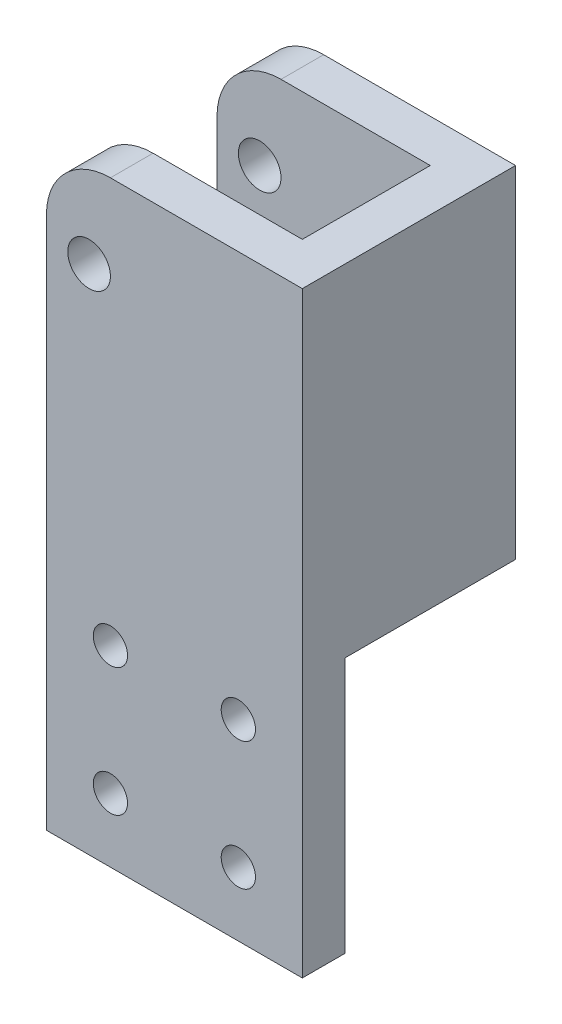
ISO-10303-21;
HEADER;
FILE_DESCRIPTION(('STEP AP214'),'2;1');
FILE_NAME('part.step','',(''),(''),'','','');
FILE_SCHEMA(('AUTOMOTIVE_DESIGN { 1 0 10303 214 1 1 1 1 }'));
ENDSEC;
DATA;
#1=APPLICATION_CONTEXT('core data for automotive mechanical design processes');
#2=APPLICATION_PROTOCOL_DEFINITION('international standard','automotive_design',2000,#1);
#3=PRODUCT_CONTEXT('',#1,'mechanical');
#4=PRODUCT('Part','Part','',(#3));
#5=PRODUCT_RELATED_PRODUCT_CATEGORY('part','',(#4));
#6=PRODUCT_DEFINITION_FORMATION('','',#4);
#7=PRODUCT_DEFINITION_CONTEXT('part definition',#1,'design');
#8=PRODUCT_DEFINITION('design','',#6,#7);
#9=PRODUCT_DEFINITION_SHAPE('','',#8);
#10=(LENGTH_UNIT() NAMED_UNIT(*) SI_UNIT(.MILLI.,.METRE.));
#11=(NAMED_UNIT(*) PLANE_ANGLE_UNIT() SI_UNIT($,.RADIAN.));
#12=(NAMED_UNIT(*) SI_UNIT($,.STERADIAN.) SOLID_ANGLE_UNIT());
#13=UNCERTAINTY_MEASURE_WITH_UNIT(LENGTH_MEASURE(1.E-05),#10,'distance_accuracy_value','');
#14=(GEOMETRIC_REPRESENTATION_CONTEXT(3) GLOBAL_UNCERTAINTY_ASSIGNED_CONTEXT((#13)) GLOBAL_UNIT_ASSIGNED_CONTEXT((#10,
#11,#12)) REPRESENTATION_CONTEXT('',''));
#15=CARTESIAN_POINT('',(0.,0.,0.));
#16=DIRECTION('',(0.,0.,1.));
#17=DIRECTION('',(1.,0.,0.));
#18=AXIS2_PLACEMENT_3D('',#15,#16,#17);
#19=CARTESIAN_POINT('',(31.75,0.,-6.35));
#20=DIRECTION('',(0.,0.,1.));
#21=DIRECTION('',(1.,0.,0.));
#22=AXIS2_PLACEMENT_3D('',#19,#20,#21);
#23=PLANE('',#22);
#24=CARTESIAN_POINT('',(9.525,-3.175,-6.35));
#25=DIRECTION('',(0.,0.,1.));
#26=DIRECTION('',(1.,0.,0.));
#27=AXIS2_PLACEMENT_3D('',#24,#25,#26);
#28=CIRCLE('',#27,2.55269999999999);
#29=CARTESIAN_POINT('',(12.0777,-3.175,-6.35));
#30=VERTEX_POINT('',#29);
#31=EDGE_CURVE('E334',#30,#30,#28,.T.);
#32=ORIENTED_EDGE('',*,*,#31,.T.);
#33=EDGE_LOOP('',(#32));
#34=FACE_BOUND('',#33,.T.);
#35=CARTESIAN_POINT('',(28.575,-3.17500000000059,-6.35));
#36=DIRECTION('',(0.,0.,1.));
#37=DIRECTION('',(1.,0.,0.));
#38=AXIS2_PLACEMENT_3D('',#35,#36,#37);
#39=CIRCLE('',#38,2.55269999999999);
#40=CARTESIAN_POINT('',(31.1277,-3.17500000000059,-6.35));
#41=VERTEX_POINT('',#40);
#42=EDGE_CURVE('E338',#41,#41,#39,.T.);
#43=ORIENTED_EDGE('',*,*,#42,.T.);
#44=EDGE_LOOP('',(#43));
#45=FACE_BOUND('',#44,.T.);
#46=CARTESIAN_POINT('',(9.525,15.875,-6.35));
#47=DIRECTION('',(0.,0.,1.));
#48=DIRECTION('',(1.,0.,0.));
#49=AXIS2_PLACEMENT_3D('',#46,#47,#48);
#50=CIRCLE('',#49,2.55269999999999);
#51=CARTESIAN_POINT('',(12.0777,15.875,-6.35));
#52=VERTEX_POINT('',#51);
#53=EDGE_CURVE('E347',#52,#52,#50,.T.);
#54=ORIENTED_EDGE('',*,*,#53,.T.);
#55=EDGE_LOOP('',(#54));
#56=FACE_BOUND('',#55,.T.);
#57=CARTESIAN_POINT('',(28.575,15.875,-6.35));
#58=DIRECTION('',(0.,0.,1.));
#59=DIRECTION('',(1.,0.,0.));
#60=AXIS2_PLACEMENT_3D('',#57,#58,#59);
#61=CIRCLE('',#60,2.55269999999999);
#62=CARTESIAN_POINT('',(31.1277,15.875,-6.35));
#63=VERTEX_POINT('',#62);
#64=EDGE_CURVE('E147',#63,#63,#61,.T.);
#65=ORIENTED_EDGE('',*,*,#64,.T.);
#66=EDGE_LOOP('',(#65));
#67=FACE_BOUND('',#66,.T.);
#68=DIRECTION('',(0.,1.,0.));
#69=VECTOR('',#68,1.);
#70=CARTESIAN_POINT('',(0.,0.,-6.35));
#71=LINE('',#70,#69);
#72=CARTESIAN_POINT('',(0.,-12.7,-6.35));
#73=VERTEX_POINT('',#72);
#74=CARTESIAN_POINT('',(0.,25.4,-6.35));
#75=VERTEX_POINT('',#74);
#76=EDGE_CURVE('E122',#73,#75,#71,.T.);
#77=ORIENTED_EDGE('',*,*,#76,.T.);
#78=DIRECTION('',(-1.,0.,0.));
#79=VECTOR('',#78,1.);
#80=CARTESIAN_POINT('',(38.1,25.4,-6.35));
#81=LINE('',#80,#79);
#82=CARTESIAN_POINT('',(38.1,25.4,-6.35));
#83=VERTEX_POINT('',#82);
#84=EDGE_CURVE('E55',#83,#75,#81,.T.);
#85=ORIENTED_EDGE('',*,*,#84,.F.);
#86=DIRECTION('',(0.,1.,0.));
#87=VECTOR('',#86,1.);
#88=CARTESIAN_POINT('',(38.1,0.,-6.35));
#89=LINE('',#88,#87);
#90=CARTESIAN_POINT('',(38.1,-12.7,-6.35));
#91=VERTEX_POINT('',#90);
#92=EDGE_CURVE('E137',#91,#83,#89,.T.);
#93=ORIENTED_EDGE('',*,*,#92,.F.);
#94=DIRECTION('',(1.,0.,0.));
#95=VECTOR('',#94,1.);
#96=CARTESIAN_POINT('',(0.,-12.7,-6.35));
#97=LINE('',#96,#95);
#98=EDGE_CURVE('E135',#73,#91,#97,.T.);
#99=ORIENTED_EDGE('',*,*,#98,.F.);
#100=EDGE_LOOP('',(#77,#85,#93,#99));
#101=FACE_BOUND('',#100,.T.);
#102=ADVANCED_FACE('F32',(#34,#45,#56,#67,#101),#23,.F.);
#103=CARTESIAN_POINT('',(0.,0.,-31.75));
#104=DIRECTION('',(-1.,0.,0.));
#105=DIRECTION('',(0.,0.,1.));
#106=AXIS2_PLACEMENT_3D('',#103,#104,#105);
#107=PLANE('',#106);
#108=DIRECTION('',(0.,-1.,0.));
#109=VECTOR('',#108,1.);
#110=CARTESIAN_POINT('',(0.,0.,0.));
#111=LINE('',#110,#109);
#112=CARTESIAN_POINT('',(0.,66.675,0.));
#113=VERTEX_POINT('',#112);
#114=CARTESIAN_POINT('',(0.,-12.7,0.));
#115=VERTEX_POINT('',#114);
#116=EDGE_CURVE('E199',#113,#115,#111,.T.);
#117=ORIENTED_EDGE('',*,*,#116,.F.);
#118=DIRECTION('',(0.,0.,1.));
#119=VECTOR('',#118,1.);
#120=CARTESIAN_POINT('',(0.,66.675,-31.75));
#121=LINE('',#120,#119);
#122=CARTESIAN_POINT('',(0.,66.675,-6.35));
#123=VERTEX_POINT('',#122);
#124=EDGE_CURVE('E224',#113,#123,#121,.F.);
#125=ORIENTED_EDGE('',*,*,#124,.T.);
#126=CARTESIAN_POINT('',(0.,31.75,-6.35));
#127=VERTEX_POINT('',#126);
#128=EDGE_CURVE('E132',#127,#123,#71,.T.);
#129=ORIENTED_EDGE('',*,*,#128,.F.);
#130=DIRECTION('',(0.,0.,-1.));
#131=VECTOR('',#130,1.);
#132=CARTESIAN_POINT('',(0.,31.75,-25.4));
#133=LINE('',#132,#131);
#134=CARTESIAN_POINT('',(0.,31.75,-25.4));
#135=VERTEX_POINT('',#134);
#136=EDGE_CURVE('E156',#127,#135,#133,.T.);
#137=ORIENTED_EDGE('',*,*,#136,.T.);
#138=DIRECTION('',(0.,1.,0.));
#139=VECTOR('',#138,1.);
#140=CARTESIAN_POINT('',(0.,25.4,-25.4));
#141=LINE('',#140,#139);
#142=CARTESIAN_POINT('',(0.,66.675,-25.4));
#143=VERTEX_POINT('',#142);
#144=EDGE_CURVE('E176',#135,#143,#141,.T.);
#145=ORIENTED_EDGE('',*,*,#144,.T.);
#146=DIRECTION('',(0.,0.,1.));
#147=VECTOR('',#146,1.);
#148=CARTESIAN_POINT('',(0.,66.675,0.));
#149=LINE('',#148,#147);
#150=CARTESIAN_POINT('',(0.,66.675,-31.75));
#151=VERTEX_POINT('',#150);
#152=EDGE_CURVE('E40',#143,#151,#149,.F.);
#153=ORIENTED_EDGE('',*,*,#152,.T.);
#154=DIRECTION('',(0.,1.,0.));
#155=VECTOR('',#154,1.);
#156=CARTESIAN_POINT('',(0.,25.4,-31.75));
#157=LINE('',#156,#155);
#158=CARTESIAN_POINT('',(0.,25.4,-31.75));
#159=VERTEX_POINT('',#158);
#160=EDGE_CURVE('E179',#159,#151,#157,.T.);
#161=ORIENTED_EDGE('',*,*,#160,.F.);
#162=DIRECTION('',(0.,0.,1.));
#163=VECTOR('',#162,1.);
#164=CARTESIAN_POINT('',(0.,25.4,0.));
#165=LINE('',#164,#163);
#166=EDGE_CURVE('E129',#159,#75,#165,.T.);
#167=ORIENTED_EDGE('',*,*,#166,.T.);
#168=ORIENTED_EDGE('',*,*,#76,.F.);
#169=DIRECTION('',(0.,0.,-1.));
#170=VECTOR('',#169,1.);
#171=CARTESIAN_POINT('',(0.,-12.7,-6.35));
#172=LINE('',#171,#170);
#173=EDGE_CURVE('E127',#115,#73,#172,.T.);
#174=ORIENTED_EDGE('',*,*,#173,.F.);
#175=EDGE_LOOP('',(#117,#125,#129,#137,#145,#153,#161,#167,#168,#174));
#176=FACE_BOUND('',#175,.T.);
#177=ADVANCED_FACE('F125',(#176),#107,.T.);
#178=CARTESIAN_POINT('',(0.,76.2,-31.75));
#179=DIRECTION('',(0.,1.,0.));
#180=DIRECTION('',(0.,0.,1.));
#181=AXIS2_PLACEMENT_3D('',#178,#179,#180);
#182=PLANE('',#181);
#183=DIRECTION('',(-1.,0.,0.));
#184=VECTOR('',#183,1.);
#185=CARTESIAN_POINT('',(31.75,76.2,-6.35));
#186=LINE('',#185,#184);
#187=CARTESIAN_POINT('',(31.75,76.2,-6.35));
#188=VERTEX_POINT('',#187);
#189=CARTESIAN_POINT('',(9.525,76.2,-6.35));
#190=VERTEX_POINT('',#189);
#191=EDGE_CURVE('E195',#188,#190,#186,.T.);
#192=ORIENTED_EDGE('',*,*,#191,.T.);
#193=DIRECTION('',(0.,0.,1.));
#194=VECTOR('',#193,1.);
#195=CARTESIAN_POINT('',(9.525,76.2,-31.75));
#196=LINE('',#195,#194);
#197=CARTESIAN_POINT('',(9.525,76.2,0.));
#198=VERTEX_POINT('',#197);
#199=EDGE_CURVE('E219',#190,#198,#196,.T.);
#200=ORIENTED_EDGE('',*,*,#199,.T.);
#201=DIRECTION('',(-1.,0.,0.));
#202=VECTOR('',#201,1.);
#203=CARTESIAN_POINT('',(0.,76.2,0.));
#204=LINE('',#203,#202);
#205=CARTESIAN_POINT('',(38.1,76.2,0.));
#206=VERTEX_POINT('',#205);
#207=EDGE_CURVE('E203',#206,#198,#204,.T.);
#208=ORIENTED_EDGE('',*,*,#207,.F.);
#209=DIRECTION('',(0.,0.,1.));
#210=VECTOR('',#209,1.);
#211=CARTESIAN_POINT('',(38.1,76.2,-31.75));
#212=LINE('',#211,#210);
#213=CARTESIAN_POINT('',(38.1,76.2,-31.75));
#214=VERTEX_POINT('',#213);
#215=EDGE_CURVE('E206',#214,#206,#212,.T.);
#216=ORIENTED_EDGE('',*,*,#215,.F.);
#217=DIRECTION('',(-1.,0.,0.));
#218=VECTOR('',#217,1.);
#219=CARTESIAN_POINT('',(0.,76.2,-31.75));
#220=LINE('',#219,#218);
#221=CARTESIAN_POINT('',(9.525,76.2,-31.75));
#222=VERTEX_POINT('',#221);
#223=EDGE_CURVE('E202',#214,#222,#220,.T.);
#224=ORIENTED_EDGE('',*,*,#223,.T.);
#225=DIRECTION('',(0.,0.,1.));
#226=VECTOR('',#225,1.);
#227=CARTESIAN_POINT('',(9.525,76.2,-31.75));
#228=LINE('',#227,#226);
#229=CARTESIAN_POINT('',(9.525,76.2,-25.4));
#230=VERTEX_POINT('',#229);
#231=EDGE_CURVE('E214',#222,#230,#228,.T.);
#232=ORIENTED_EDGE('',*,*,#231,.T.);
#233=DIRECTION('',(1.,0.,0.));
#234=VECTOR('',#233,1.);
#235=CARTESIAN_POINT('',(0.,76.2,-25.4));
#236=LINE('',#235,#234);
#237=CARTESIAN_POINT('',(31.75,76.2,-25.4));
#238=VERTEX_POINT('',#237);
#239=EDGE_CURVE('E174',#230,#238,#236,.T.);
#240=ORIENTED_EDGE('',*,*,#239,.T.);
#241=DIRECTION('',(0.,0.,-1.));
#242=VECTOR('',#241,1.);
#243=CARTESIAN_POINT('',(31.75,76.2,-31.75));
#244=LINE('',#243,#242);
#245=EDGE_CURVE('E193',#188,#238,#244,.T.);
#246=ORIENTED_EDGE('',*,*,#245,.F.);
#247=EDGE_LOOP('',(#192,#200,#208,#216,#224,#232,#240,#246));
#248=FACE_BOUND('',#247,.T.);
#249=ADVANCED_FACE('F241',(#248),#182,.T.);
#250=CARTESIAN_POINT('',(38.1,0.,-31.75));
#251=DIRECTION('',(1.,0.,0.));
#252=DIRECTION('',(0.,0.,-1.));
#253=AXIS2_PLACEMENT_3D('',#250,#251,#252);
#254=PLANE('',#253);
#255=DIRECTION('',(0.,0.,-1.));
#256=VECTOR('',#255,1.);
#257=CARTESIAN_POINT('',(38.1,25.4,-31.75));
#258=LINE('',#257,#256);
#259=CARTESIAN_POINT('',(38.1,25.4,-31.75));
#260=VERTEX_POINT('',#259);
#261=EDGE_CURVE('E186',#83,#260,#258,.T.);
#262=ORIENTED_EDGE('',*,*,#261,.T.);
#263=DIRECTION('',(0.,1.,0.));
#264=VECTOR('',#263,1.);
#265=CARTESIAN_POINT('',(38.1,0.,-31.75));
#266=LINE('',#265,#264);
#267=EDGE_CURVE('E200',#260,#214,#266,.T.);
#268=ORIENTED_EDGE('',*,*,#267,.T.);
#269=ORIENTED_EDGE('',*,*,#215,.T.);
#270=DIRECTION('',(0.,1.,0.));
#271=VECTOR('',#270,1.);
#272=CARTESIAN_POINT('',(38.1,0.,0.));
#273=LINE('',#272,#271);
#274=CARTESIAN_POINT('',(38.1,-12.7,0.));
#275=VERTEX_POINT('',#274);
#276=EDGE_CURVE('E208',#275,#206,#273,.T.);
#277=ORIENTED_EDGE('',*,*,#276,.F.);
#278=DIRECTION('',(0.,0.,1.));
#279=VECTOR('',#278,1.);
#280=CARTESIAN_POINT('',(38.1,-12.7,-6.35));
#281=LINE('',#280,#279);
#282=EDGE_CURVE('E141',#91,#275,#281,.T.);
#283=ORIENTED_EDGE('',*,*,#282,.F.);
#284=ORIENTED_EDGE('',*,*,#92,.T.);
#285=EDGE_LOOP('',(#262,#268,#269,#277,#283,#284));
#286=FACE_BOUND('',#285,.T.);
#287=ADVANCED_FACE('F266',(#286),#254,.T.);
#288=CARTESIAN_POINT('',(0.,0.,-31.75));
#289=DIRECTION('',(0.,0.,-1.));
#290=DIRECTION('',(-1.,0.,0.));
#291=AXIS2_PLACEMENT_3D('',#288,#289,#290);
#292=PLANE('',#291);
#293=CARTESIAN_POINT('',(6.35,63.5,-31.75));
#294=DIRECTION('',(0.,0.,-1.));
#295=DIRECTION('',(-1.,0.,0.));
#296=AXIS2_PLACEMENT_3D('',#293,#294,#295);
#297=CIRCLE('',#296,3.175);
#298=CARTESIAN_POINT('',(3.175,63.5,-31.75));
#299=VERTEX_POINT('',#298);
#300=EDGE_CURVE('E164',#299,#299,#297,.T.);
#301=ORIENTED_EDGE('',*,*,#300,.F.);
#302=EDGE_LOOP('',(#301));
#303=FACE_BOUND('',#302,.T.);
#304=ORIENTED_EDGE('',*,*,#160,.T.);
#305=CARTESIAN_POINT('',(9.525,66.675,-31.75));
#306=DIRECTION('',(0.,0.,-1.));
#307=DIRECTION('',(-1.,0.,0.));
#308=AXIS2_PLACEMENT_3D('',#305,#306,#307);
#309=CIRCLE('',#308,9.525);
#310=EDGE_CURVE('E11',#151,#222,#309,.T.);
#311=ORIENTED_EDGE('',*,*,#310,.T.);
#312=ORIENTED_EDGE('',*,*,#223,.F.);
#313=ORIENTED_EDGE('',*,*,#267,.F.);
#314=DIRECTION('',(-1.,0.,0.));
#315=VECTOR('',#314,1.);
#316=CARTESIAN_POINT('',(38.1,25.4,-31.75));
#317=LINE('',#316,#315);
#318=EDGE_CURVE('E189',#260,#159,#317,.T.);
#319=ORIENTED_EDGE('',*,*,#318,.T.);
#320=EDGE_LOOP('',(#304,#311,#312,#313,#319));
#321=FACE_BOUND('',#320,.T.);
#322=ADVANCED_FACE('F235',(#303,#321),#292,.T.);
#323=CARTESIAN_POINT('',(0.,0.,0.));
#324=DIRECTION('',(0.,0.,-1.));
#325=DIRECTION('',(-1.,0.,0.));
#326=AXIS2_PLACEMENT_3D('',#323,#324,#325);
#327=PLANE('',#326);
#328=CARTESIAN_POINT('',(9.525,-3.175,0.));
#329=DIRECTION('',(0.,0.,1.));
#330=DIRECTION('',(1.,0.,0.));
#331=AXIS2_PLACEMENT_3D('',#328,#329,#330);
#332=CIRCLE('',#331,2.55269999999999);
#333=CARTESIAN_POINT('',(12.0777,-3.175,0.));
#334=VERTEX_POINT('',#333);
#335=EDGE_CURVE('E332',#334,#334,#332,.T.);
#336=ORIENTED_EDGE('',*,*,#335,.F.);
#337=EDGE_LOOP('',(#336));
#338=FACE_BOUND('',#337,.T.);
#339=CARTESIAN_POINT('',(28.575,-3.17500000000059,0.));
#340=DIRECTION('',(0.,0.,1.));
#341=DIRECTION('',(1.,0.,0.));
#342=AXIS2_PLACEMENT_3D('',#339,#340,#341);
#343=CIRCLE('',#342,2.55269999999999);
#344=CARTESIAN_POINT('',(31.1277,-3.17500000000059,0.));
#345=VERTEX_POINT('',#344);
#346=EDGE_CURVE('E335',#345,#345,#343,.T.);
#347=ORIENTED_EDGE('',*,*,#346,.F.);
#348=EDGE_LOOP('',(#347));
#349=FACE_BOUND('',#348,.T.);
#350=CARTESIAN_POINT('',(9.525,15.875,0.));
#351=DIRECTION('',(0.,0.,1.));
#352=DIRECTION('',(1.,0.,0.));
#353=AXIS2_PLACEMENT_3D('',#350,#351,#352);
#354=CIRCLE('',#353,2.55269999999999);
#355=CARTESIAN_POINT('',(12.0777,15.875,0.));
#356=VERTEX_POINT('',#355);
#357=EDGE_CURVE('E344',#356,#356,#354,.T.);
#358=ORIENTED_EDGE('',*,*,#357,.F.);
#359=EDGE_LOOP('',(#358));
#360=FACE_BOUND('',#359,.T.);
#361=CARTESIAN_POINT('',(28.575,15.875,0.));
#362=DIRECTION('',(0.,0.,1.));
#363=DIRECTION('',(1.,0.,0.));
#364=AXIS2_PLACEMENT_3D('',#361,#362,#363);
#365=CIRCLE('',#364,2.55269999999999);
#366=CARTESIAN_POINT('',(31.1277,15.875,0.));
#367=VERTEX_POINT('',#366);
#368=EDGE_CURVE('E150',#367,#367,#365,.T.);
#369=ORIENTED_EDGE('',*,*,#368,.F.);
#370=EDGE_LOOP('',(#369));
#371=FACE_BOUND('',#370,.T.);
#372=CARTESIAN_POINT('',(6.35,63.5,0.));
#373=DIRECTION('',(0.,0.,-1.));
#374=DIRECTION('',(-1.,0.,0.));
#375=AXIS2_PLACEMENT_3D('',#372,#373,#374);
#376=CIRCLE('',#375,3.175);
#377=CARTESIAN_POINT('',(3.175,63.5,0.));
#378=VERTEX_POINT('',#377);
#379=EDGE_CURVE('E171',#378,#378,#376,.T.);
#380=ORIENTED_EDGE('',*,*,#379,.T.);
#381=EDGE_LOOP('',(#380));
#382=FACE_BOUND('',#381,.T.);
#383=ORIENTED_EDGE('',*,*,#207,.T.);
#384=CARTESIAN_POINT('',(9.525,66.675,0.));
#385=DIRECTION('',(0.,0.,-1.));
#386=DIRECTION('',(-1.,0.,0.));
#387=AXIS2_PLACEMENT_3D('',#384,#385,#386);
#388=CIRCLE('',#387,9.525);
#389=EDGE_CURVE('E222',#198,#113,#388,.F.);
#390=ORIENTED_EDGE('',*,*,#389,.T.);
#391=ORIENTED_EDGE('',*,*,#116,.T.);
#392=DIRECTION('',(-1.,0.,0.));
#393=VECTOR('',#392,1.);
#394=CARTESIAN_POINT('',(0.,-12.7,0.));
#395=LINE('',#394,#393);
#396=EDGE_CURVE('E146',#275,#115,#395,.T.);
#397=ORIENTED_EDGE('',*,*,#396,.F.);
#398=ORIENTED_EDGE('',*,*,#276,.T.);
#399=EDGE_LOOP('',(#383,#390,#391,#397,#398));
#400=FACE_BOUND('',#399,.T.);
#401=ADVANCED_FACE('F264',(#338,#349,#360,#371,#382,#400),#327,.F.);
#402=CARTESIAN_POINT('',(6.35,63.5,-6.35));
#403=DIRECTION('',(0.,0.,1.));
#404=DIRECTION('',(1.,0.,0.));
#405=AXIS2_PLACEMENT_3D('',#402,#403,#404);
#406=CIRCLE('',#405,3.175);
#407=CARTESIAN_POINT('',(9.525,63.5,-6.35));
#408=VERTEX_POINT('',#407);
#409=EDGE_CURVE('E168',#408,#408,#406,.T.);
#410=ORIENTED_EDGE('',*,*,#409,.T.);
#411=EDGE_LOOP('',(#410));
#412=FACE_BOUND('',#411,.T.);
#413=DIRECTION('',(0.,1.,0.));
#414=VECTOR('',#413,1.);
#415=CARTESIAN_POINT('',(31.75,0.,-6.35));
#416=LINE('',#415,#414);
#417=CARTESIAN_POINT('',(31.75,31.75,-6.35));
#418=VERTEX_POINT('',#417);
#419=EDGE_CURVE('E131',#418,#188,#416,.T.);
#420=ORIENTED_EDGE('',*,*,#419,.F.);
#421=DIRECTION('',(-1.,0.,0.));
#422=VECTOR('',#421,1.);
#423=CARTESIAN_POINT('',(0.,31.75,-6.35));
#424=LINE('',#423,#422);
#425=EDGE_CURVE('E47',#418,#127,#424,.T.);
#426=ORIENTED_EDGE('',*,*,#425,.T.);
#427=ORIENTED_EDGE('',*,*,#128,.T.);
#428=CARTESIAN_POINT('',(9.525,66.675,-6.35));
#429=DIRECTION('',(0.,0.,1.));
#430=DIRECTION('',(1.,0.,0.));
#431=AXIS2_PLACEMENT_3D('',#428,#429,#430);
#432=CIRCLE('',#431,9.525);
#433=EDGE_CURVE('E227',#123,#190,#432,.F.);
#434=ORIENTED_EDGE('',*,*,#433,.T.);
#435=ORIENTED_EDGE('',*,*,#191,.F.);
#436=EDGE_LOOP('',(#420,#426,#427,#434,#435));
#437=FACE_BOUND('',#436,.T.);
#438=ADVANCED_FACE('F257',(#412,#437),#23,.F.);
#439=CARTESIAN_POINT('',(31.75,0.,0.));
#440=DIRECTION('',(1.,0.,0.));
#441=DIRECTION('',(0.,0.,-1.));
#442=AXIS2_PLACEMENT_3D('',#439,#440,#441);
#443=PLANE('',#442);
#444=DIRECTION('',(0.,1.,0.));
#445=VECTOR('',#444,1.);
#446=CARTESIAN_POINT('',(31.75,25.4,-25.4));
#447=LINE('',#446,#445);
#448=CARTESIAN_POINT('',(31.75,31.75,-25.4));
#449=VERTEX_POINT('',#448);
#450=EDGE_CURVE('E182',#449,#238,#447,.T.);
#451=ORIENTED_EDGE('',*,*,#450,.F.);
#452=DIRECTION('',(0.,0.,1.));
#453=VECTOR('',#452,1.);
#454=CARTESIAN_POINT('',(31.75,31.75,-25.4));
#455=LINE('',#454,#453);
#456=EDGE_CURVE('E161',#449,#418,#455,.T.);
#457=ORIENTED_EDGE('',*,*,#456,.T.);
#458=ORIENTED_EDGE('',*,*,#419,.T.);
#459=ORIENTED_EDGE('',*,*,#245,.T.);
#460=EDGE_LOOP('',(#451,#457,#458,#459));
#461=FACE_BOUND('',#460,.T.);
#462=ADVANCED_FACE('F251',(#461),#443,.F.);
#463=CARTESIAN_POINT('',(38.1,25.4,-31.75));
#464=DIRECTION('',(0.,1.,0.));
#465=DIRECTION('',(0.,0.,1.));
#466=AXIS2_PLACEMENT_3D('',#463,#464,#465);
#467=PLANE('',#466);
#468=ORIENTED_EDGE('',*,*,#84,.T.);
#469=ORIENTED_EDGE('',*,*,#166,.F.);
#470=ORIENTED_EDGE('',*,*,#318,.F.);
#471=ORIENTED_EDGE('',*,*,#261,.F.);
#472=EDGE_LOOP('',(#468,#469,#470,#471));
#473=FACE_BOUND('',#472,.T.);
#474=ADVANCED_FACE('F267',(#473),#467,.F.);
#475=CARTESIAN_POINT('',(0.,25.4,-25.4));
#476=DIRECTION('',(0.,0.,1.));
#477=DIRECTION('',(1.,0.,0.));
#478=AXIS2_PLACEMENT_3D('',#475,#476,#477);
#479=PLANE('',#478);
#480=DIRECTION('',(1.,0.,0.));
#481=VECTOR('',#480,1.);
#482=CARTESIAN_POINT('',(0.,31.75,-25.4));
#483=LINE('',#482,#481);
#484=EDGE_CURVE('E159',#135,#449,#483,.T.);
#485=ORIENTED_EDGE('',*,*,#484,.T.);
#486=ORIENTED_EDGE('',*,*,#450,.T.);
#487=ORIENTED_EDGE('',*,*,#239,.F.);
#488=CARTESIAN_POINT('',(9.525,66.675,-25.4));
#489=DIRECTION('',(0.,0.,1.));
#490=DIRECTION('',(1.,0.,0.));
#491=AXIS2_PLACEMENT_3D('',#488,#489,#490);
#492=CIRCLE('',#491,9.525);
#493=EDGE_CURVE('E229',#230,#143,#492,.T.);
#494=ORIENTED_EDGE('',*,*,#493,.T.);
#495=ORIENTED_EDGE('',*,*,#144,.F.);
#496=EDGE_LOOP('',(#485,#486,#487,#494,#495));
#497=FACE_BOUND('',#496,.T.);
#498=CARTESIAN_POINT('',(6.35,63.5,-25.4));
#499=DIRECTION('',(0.,0.,1.));
#500=DIRECTION('',(1.,0.,0.));
#501=AXIS2_PLACEMENT_3D('',#498,#499,#500);
#502=CIRCLE('',#501,3.175);
#503=CARTESIAN_POINT('',(9.525,63.5,-25.4));
#504=VERTEX_POINT('',#503);
#505=EDGE_CURVE('E167',#504,#504,#502,.T.);
#506=ORIENTED_EDGE('',*,*,#505,.F.);
#507=EDGE_LOOP('',(#506));
#508=FACE_BOUND('',#507,.T.);
#509=ADVANCED_FACE('F245',(#497,#508),#479,.T.);
#510=CARTESIAN_POINT('',(6.35,63.5,19.05));
#511=DIRECTION('',(0.,0.,-1.));
#512=DIRECTION('',(-1.,0.,0.));
#513=AXIS2_PLACEMENT_3D('',#510,#511,#512);
#514=CYLINDRICAL_SURFACE('',#513,3.175);
#515=ORIENTED_EDGE('',*,*,#505,.T.);
#516=EDGE_LOOP('',(#515));
#517=FACE_BOUND('',#516,.T.);
#518=ORIENTED_EDGE('',*,*,#300,.T.);
#519=EDGE_LOOP('',(#518));
#520=FACE_BOUND('',#519,.T.);
#521=ADVANCED_FACE('F274',(#517,#520),#514,.F.);
#522=ORIENTED_EDGE('',*,*,#409,.F.);
#523=EDGE_LOOP('',(#522));
#524=FACE_BOUND('',#523,.T.);
#525=ORIENTED_EDGE('',*,*,#379,.F.);
#526=EDGE_LOOP('',(#525));
#527=FACE_BOUND('',#526,.T.);
#528=ADVANCED_FACE('F296',(#524,#527),#514,.F.);
#529=CARTESIAN_POINT('',(9.525,66.675,-31.75));
#530=DIRECTION('',(0.,0.,1.));
#531=DIRECTION('',(1.,0.,0.));
#532=AXIS2_PLACEMENT_3D('',#529,#530,#531);
#533=CYLINDRICAL_SURFACE('',#532,9.525);
#534=ORIENTED_EDGE('',*,*,#433,.F.);
#535=ORIENTED_EDGE('',*,*,#124,.F.);
#536=ORIENTED_EDGE('',*,*,#389,.F.);
#537=ORIENTED_EDGE('',*,*,#199,.F.);
#538=EDGE_LOOP('',(#534,#535,#536,#537));
#539=FACE_BOUND('',#538,.T.);
#540=ADVANCED_FACE('F262',(#539),#533,.T.);
#541=CARTESIAN_POINT('',(9.525,66.675,-31.75));
#542=DIRECTION('',(0.,0.,1.));
#543=DIRECTION('',(1.,0.,0.));
#544=AXIS2_PLACEMENT_3D('',#541,#542,#543);
#545=CYLINDRICAL_SURFACE('',#544,9.525);
#546=ORIENTED_EDGE('',*,*,#310,.F.);
#547=ORIENTED_EDGE('',*,*,#152,.F.);
#548=ORIENTED_EDGE('',*,*,#493,.F.);
#549=ORIENTED_EDGE('',*,*,#231,.F.);
#550=EDGE_LOOP('',(#546,#547,#548,#549));
#551=FACE_BOUND('',#550,.T.);
#552=ADVANCED_FACE('F34',(#551),#545,.T.);
#553=CARTESIAN_POINT('',(0.,31.75,0.));
#554=DIRECTION('',(0.,1.,0.));
#555=DIRECTION('',(0.,0.,1.));
#556=AXIS2_PLACEMENT_3D('',#553,#554,#555);
#557=PLANE('',#556);
#558=ORIENTED_EDGE('',*,*,#136,.F.);
#559=ORIENTED_EDGE('',*,*,#425,.F.);
#560=ORIENTED_EDGE('',*,*,#456,.F.);
#561=ORIENTED_EDGE('',*,*,#484,.F.);
#562=EDGE_LOOP('',(#558,#559,#560,#561));
#563=FACE_BOUND('',#562,.T.);
#564=ADVANCED_FACE('F254',(#563),#557,.T.);
#565=CARTESIAN_POINT('',(0.,-12.7,0.));
#566=DIRECTION('',(0.,1.,0.));
#567=DIRECTION('',(0.,0.,1.));
#568=AXIS2_PLACEMENT_3D('',#565,#566,#567);
#569=PLANE('',#568);
#570=ORIENTED_EDGE('',*,*,#173,.T.);
#571=ORIENTED_EDGE('',*,*,#98,.T.);
#572=ORIENTED_EDGE('',*,*,#282,.T.);
#573=ORIENTED_EDGE('',*,*,#396,.T.);
#574=EDGE_LOOP('',(#570,#571,#572,#573));
#575=FACE_BOUND('',#574,.T.);
#576=ADVANCED_FACE('F144',(#575),#569,.F.);
#577=CARTESIAN_POINT('',(28.575,15.875,0.));
#578=DIRECTION('',(0.,0.,1.));
#579=DIRECTION('',(1.,0.,0.));
#580=AXIS2_PLACEMENT_3D('',#577,#578,#579);
#581=CYLINDRICAL_SURFACE('',#580,2.55269999999999);
#582=ORIENTED_EDGE('',*,*,#368,.T.);
#583=EDGE_LOOP('',(#582));
#584=FACE_BOUND('',#583,.T.);
#585=ORIENTED_EDGE('',*,*,#64,.F.);
#586=EDGE_LOOP('',(#585));
#587=FACE_BOUND('',#586,.T.);
#588=ADVANCED_FACE('F312',(#584,#587),#581,.F.);
#589=CARTESIAN_POINT('',(9.525,15.875,0.));
#590=DIRECTION('',(0.,0.,1.));
#591=DIRECTION('',(1.,0.,0.));
#592=AXIS2_PLACEMENT_3D('',#589,#590,#591);
#593=CYLINDRICAL_SURFACE('',#592,2.55269999999999);
#594=ORIENTED_EDGE('',*,*,#357,.T.);
#595=EDGE_LOOP('',(#594));
#596=FACE_BOUND('',#595,.T.);
#597=ORIENTED_EDGE('',*,*,#53,.F.);
#598=EDGE_LOOP('',(#597));
#599=FACE_BOUND('',#598,.T.);
#600=ADVANCED_FACE('F315',(#596,#599),#593,.F.);
#601=CARTESIAN_POINT('',(28.575,-3.17500000000059,0.));
#602=DIRECTION('',(0.,0.,1.));
#603=DIRECTION('',(1.,0.,0.));
#604=AXIS2_PLACEMENT_3D('',#601,#602,#603);
#605=CYLINDRICAL_SURFACE('',#604,2.55269999999999);
#606=ORIENTED_EDGE('',*,*,#346,.T.);
#607=EDGE_LOOP('',(#606));
#608=FACE_BOUND('',#607,.T.);
#609=ORIENTED_EDGE('',*,*,#42,.F.);
#610=EDGE_LOOP('',(#609));
#611=FACE_BOUND('',#610,.T.);
#612=ADVANCED_FACE('F319',(#608,#611),#605,.F.);
#613=CARTESIAN_POINT('',(9.525,-3.175,0.));
#614=DIRECTION('',(0.,0.,1.));
#615=DIRECTION('',(1.,0.,0.));
#616=AXIS2_PLACEMENT_3D('',#613,#614,#615);
#617=CYLINDRICAL_SURFACE('',#616,2.55269999999999);
#618=ORIENTED_EDGE('',*,*,#335,.T.);
#619=EDGE_LOOP('',(#618));
#620=FACE_BOUND('',#619,.T.);
#621=ORIENTED_EDGE('',*,*,#31,.F.);
#622=EDGE_LOOP('',(#621));
#623=FACE_BOUND('',#622,.T.);
#624=ADVANCED_FACE('F323',(#620,#623),#617,.F.);
#625=CLOSED_SHELL('',(#102,#177,#249,#287,#322,#401,#438,#462,#474,#509,#521,#528,#540,#552,
#564,#576,#588,#600,#612,#624));
#626=MANIFOLD_SOLID_BREP('B2',#625);
#627=ADVANCED_BREP_SHAPE_REPRESENTATION('',(#18,#626),#14);
#628=SHAPE_DEFINITION_REPRESENTATION(#9,#627);
ENDSEC;
END-ISO-10303-21;
